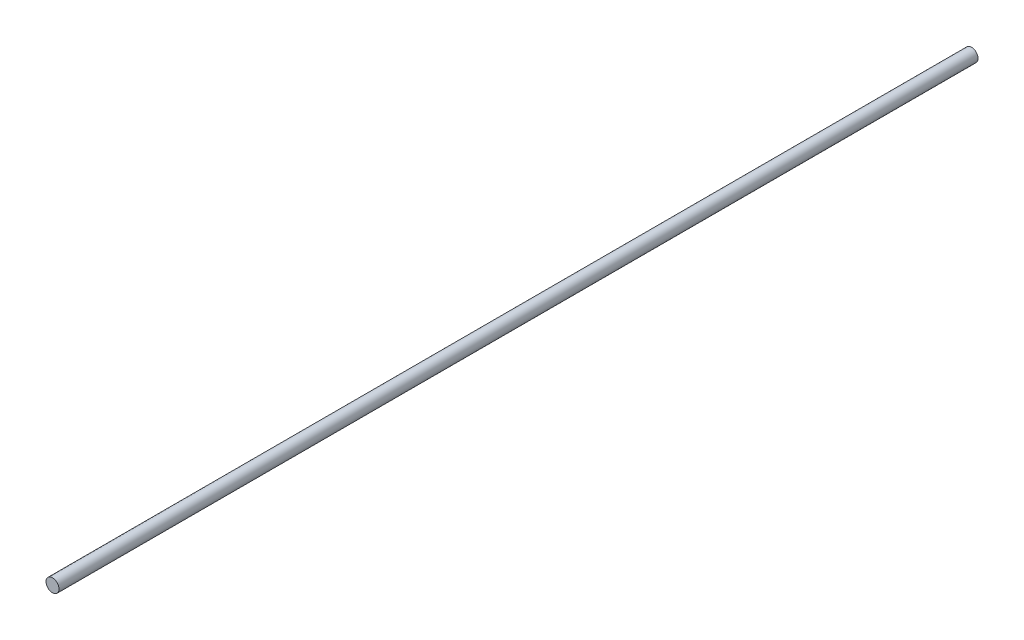
ISO-10303-21;
HEADER;
FILE_DESCRIPTION(('STEP AP214'),'2;1');
FILE_NAME('part.step','',(''),(''),'','','');
FILE_SCHEMA(('AUTOMOTIVE_DESIGN { 1 0 10303 214 1 1 1 1 }'));
ENDSEC;
DATA;
#1=APPLICATION_CONTEXT('core data for automotive mechanical design processes');
#2=APPLICATION_PROTOCOL_DEFINITION('international standard','automotive_design',2000,#1);
#3=PRODUCT_CONTEXT('',#1,'mechanical');
#4=PRODUCT('Part','Part','',(#3));
#5=PRODUCT_RELATED_PRODUCT_CATEGORY('part','',(#4));
#6=PRODUCT_DEFINITION_FORMATION('','',#4);
#7=PRODUCT_DEFINITION_CONTEXT('part definition',#1,'design');
#8=PRODUCT_DEFINITION('design','',#6,#7);
#9=PRODUCT_DEFINITION_SHAPE('','',#8);
#10=(LENGTH_UNIT() NAMED_UNIT(*) SI_UNIT(.MILLI.,.METRE.));
#11=(NAMED_UNIT(*) PLANE_ANGLE_UNIT() SI_UNIT($,.RADIAN.));
#12=(NAMED_UNIT(*) SI_UNIT($,.STERADIAN.) SOLID_ANGLE_UNIT());
#13=UNCERTAINTY_MEASURE_WITH_UNIT(LENGTH_MEASURE(1.E-05),#10,'distance_accuracy_value','');
#14=(GEOMETRIC_REPRESENTATION_CONTEXT(3) GLOBAL_UNCERTAINTY_ASSIGNED_CONTEXT((#13)) GLOBAL_UNIT_ASSIGNED_CONTEXT((#10,
#11,#12)) REPRESENTATION_CONTEXT('',''));
#15=CARTESIAN_POINT('',(0.,0.,0.));
#16=DIRECTION('',(0.,0.,1.));
#17=DIRECTION('',(1.,0.,0.));
#18=AXIS2_PLACEMENT_3D('',#15,#16,#17);
#19=CARTESIAN_POINT('',(0.,0.,898.394811379758));
#20=DIRECTION('',(0.,0.,-1.));
#21=DIRECTION('',(-1.,0.,0.));
#22=AXIS2_PLACEMENT_3D('',#19,#20,#21);
#23=CYLINDRICAL_SURFACE('',#22,6.35);
#24=CARTESIAN_POINT('',(0.,0.,898.394811379758));
#25=DIRECTION('',(0.,0.,1.));
#26=DIRECTION('',(1.,0.,0.));
#27=AXIS2_PLACEMENT_3D('',#24,#25,#26);
#28=CIRCLE('',#27,6.35);
#29=CARTESIAN_POINT('',(-6.35,0.,898.394811379758));
#30=VERTEX_POINT('',#29);
#31=EDGE_CURVE('E10',#30,#30,#28,.T.);
#32=CARTESIAN_POINT('',(0.,0.,0.));
#33=DIRECTION('',(0.,0.,1.));
#34=DIRECTION('',(1.,0.,0.));
#35=AXIS2_PLACEMENT_3D('',#32,#33,#34);
#36=CIRCLE('',#35,6.35);
#37=CARTESIAN_POINT('',(-6.35,0.,0.));
#38=VERTEX_POINT('',#37);
#39=EDGE_CURVE('E37',#38,#38,#36,.T.);
#40=CARTESIAN_POINT('',(-6.35,0.,898.394811379758));
#41=CARTESIAN_POINT('',(-6.35,0.,889.036532094552));
#42=CARTESIAN_POINT('',(-6.35,0.,879.678252809346));
#43=CARTESIAN_POINT('',(-6.35,0.,860.961694238935));
#44=CARTESIAN_POINT('',(-6.35,0.,851.603414953729));
#45=CARTESIAN_POINT('',(-6.35,0.,832.886856383317));
#46=CARTESIAN_POINT('',(-6.35,0.,823.528577098112));
#47=CARTESIAN_POINT('',(-6.35,0.,804.8120185277));
#48=CARTESIAN_POINT('',(-6.35,0.,795.453739242494));
#49=CARTESIAN_POINT('',(-6.35,0.,776.737180672082));
#50=CARTESIAN_POINT('',(-6.35,0.,767.378901386877));
#51=CARTESIAN_POINT('',(-6.35,0.,748.662342816465));
#52=CARTESIAN_POINT('',(-6.35,0.,739.304063531259));
#53=CARTESIAN_POINT('',(-6.35,0.,720.587504960848));
#54=CARTESIAN_POINT('',(-6.35,0.,711.229225675642));
#55=CARTESIAN_POINT('',(-6.35,0.,692.51266710523));
#56=CARTESIAN_POINT('',(-6.35,0.,683.154387820024));
#57=CARTESIAN_POINT('',(-6.35,0.,664.437829249613));
#58=CARTESIAN_POINT('',(-6.35,0.,655.079549964407));
#59=CARTESIAN_POINT('',(-6.35,0.,636.362991393995));
#60=CARTESIAN_POINT('',(-6.35,0.,627.004712108789));
#61=CARTESIAN_POINT('',(-6.35,0.,608.288153538378));
#62=CARTESIAN_POINT('',(-6.35,0.,598.929874253172));
#63=CARTESIAN_POINT('',(-6.35,0.,580.21331568276));
#64=CARTESIAN_POINT('',(-6.35,0.,570.855036397555));
#65=CARTESIAN_POINT('',(-6.35,0.,552.138477827143));
#66=CARTESIAN_POINT('',(-6.35,0.,542.780198541937));
#67=CARTESIAN_POINT('',(-6.35,0.,524.063639971526));
#68=CARTESIAN_POINT('',(-6.35,0.,514.70536068632));
#69=CARTESIAN_POINT('',(-6.35,0.,495.988802115908));
#70=CARTESIAN_POINT('',(-6.35,0.,486.630522830702));
#71=CARTESIAN_POINT('',(-6.35,0.,467.913964260291));
#72=CARTESIAN_POINT('',(-6.35,0.,458.555684975085));
#73=CARTESIAN_POINT('',(-6.35,0.,439.839126404673));
#74=CARTESIAN_POINT('',(-6.35,0.,430.480847119467));
#75=CARTESIAN_POINT('',(-6.35,0.,411.764288549056));
#76=CARTESIAN_POINT('',(-6.35,0.,402.40600926385));
#77=CARTESIAN_POINT('',(-6.35,0.,383.689450693438));
#78=CARTESIAN_POINT('',(-6.35,0.,374.331171408233));
#79=CARTESIAN_POINT('',(-6.35,0.,355.614612837821));
#80=CARTESIAN_POINT('',(-6.35,0.,346.256333552615));
#81=CARTESIAN_POINT('',(-6.35,0.,327.539774982203));
#82=CARTESIAN_POINT('',(-6.35,0.,318.181495696998));
#83=CARTESIAN_POINT('',(-6.35,0.,299.464937126586));
#84=CARTESIAN_POINT('',(-6.35,0.,290.10665784138));
#85=CARTESIAN_POINT('',(-6.35,0.,271.390099270969));
#86=CARTESIAN_POINT('',(-6.35,0.,262.031819985763));
#87=CARTESIAN_POINT('',(-6.35,0.,243.315261415351));
#88=CARTESIAN_POINT('',(-6.35,0.,233.956982130145));
#89=CARTESIAN_POINT('',(-6.35,0.,215.240423559734));
#90=CARTESIAN_POINT('',(-6.35,0.,205.882144274528));
#91=CARTESIAN_POINT('',(-6.35,0.,187.165585704116));
#92=CARTESIAN_POINT('',(-6.35,0.,177.80730641891));
#93=CARTESIAN_POINT('',(-6.35,0.,159.090747848499));
#94=CARTESIAN_POINT('',(-6.35,0.,149.732468563293));
#95=CARTESIAN_POINT('',(-6.35,0.,131.015909992881));
#96=CARTESIAN_POINT('',(-6.35,0.,121.657630707676));
#97=CARTESIAN_POINT('',(-6.35,0.,102.941072137264));
#98=CARTESIAN_POINT('',(-6.35,0.,93.5827928520581));
#99=CARTESIAN_POINT('',(-6.35,0.,74.8662342816465));
#100=CARTESIAN_POINT('',(-6.35,0.,65.5079549964407));
#101=CARTESIAN_POINT('',(-6.35,0.,46.7913964260291));
#102=CARTESIAN_POINT('',(-6.35,0.,37.4331171408233));
#103=CARTESIAN_POINT('',(-6.35,0.,18.7165585704116));
#104=CARTESIAN_POINT('',(-6.35,0.,9.35827928520581));
#105=CARTESIAN_POINT('',(-6.35,0.,0.));
#106=B_SPLINE_CURVE_WITH_KNOTS('',3,(#40,#41,#42,#43,#44,#45,#46,#47,#48,#49,#50,#51,#52,#53,
#54,#55,#56,#57,#58,#59,#60,#61,#62,#63,#64,#65,#66,#67,#68,#69,#70,#71,#72,#73,#74,#75,#76,#77,
#78,#79,#80,#81,#82,#83,#84,#85,#86,#87,#88,#89,#90,#91,#92,#93,#94,#95,#96,#97,#98,#99,#100,
#101,#102,#103,#104,#105),.UNSPECIFIED.,.F.,.F.,(4,2,2,2,2,2,2,2,2,2,2,2,2,2,2,2,2,2,2,2,2,2,2,
2,2,2,2,2,2,2,2,2,4),(0.,28.0748378556174,56.1496757112349,84.2245135668522,112.29935142247,
140.374189278087,168.449027133705,196.523864989322,224.598702844939,252.673540700557,
280.748378556174,308.823216411792,336.898054267409,364.972892123027,393.047729978644,
421.122567834261,449.197405689879,477.272243545496,505.347081401114,533.421919256731,
561.496757112349,589.571594967966,617.646432823584,645.721270679201,673.796108534818,
701.870946390436,729.945784246053,758.020622101671,786.095459957288,814.170297812906,
842.245135668523,870.31997352414,898.394811379758),.UNSPECIFIED.);
#107=EDGE_CURVE('BSEAM40',#30,#38,#106,.T.);
#108=ORIENTED_EDGE('',*,*,#31,.F.);
#109=ORIENTED_EDGE('',*,*,#39,.T.);
#110=ORIENTED_EDGE('',*,*,#107,.T.);
#111=ORIENTED_EDGE('',*,*,#107,.F.);
#112=EDGE_LOOP('',(#108,#110,#109,#111));
#113=FACE_BOUND('',#112,.T.);
#114=ADVANCED_FACE('F40',(#113),#23,.T.);
#115=CARTESIAN_POINT('',(0.,0.,898.394811379758));
#116=DIRECTION('',(0.,0.,1.));
#117=DIRECTION('',(1.,0.,0.));
#118=AXIS2_PLACEMENT_3D('',#115,#116,#117);
#119=PLANE('',#118);
#120=ORIENTED_EDGE('',*,*,#31,.T.);
#121=EDGE_LOOP('',(#120));
#122=FACE_BOUND('',#121,.T.);
#123=ADVANCED_FACE('F55',(#122),#119,.T.);
#124=CARTESIAN_POINT('',(0.,0.,0.));
#125=DIRECTION('',(0.,0.,1.));
#126=DIRECTION('',(1.,0.,0.));
#127=AXIS2_PLACEMENT_3D('',#124,#125,#126);
#128=PLANE('',#127);
#129=ORIENTED_EDGE('',*,*,#39,.F.);
#130=EDGE_LOOP('',(#129));
#131=FACE_BOUND('',#130,.T.);
#132=ADVANCED_FACE('F49',(#131),#128,.F.);
#133=CLOSED_SHELL('',(#114,#123,#132));
#134=MANIFOLD_SOLID_BREP('B2',#133);
#135=ADVANCED_BREP_SHAPE_REPRESENTATION('',(#18,#134),#14);
#136=SHAPE_DEFINITION_REPRESENTATION(#9,#135);
ENDSEC;
END-ISO-10303-21;
